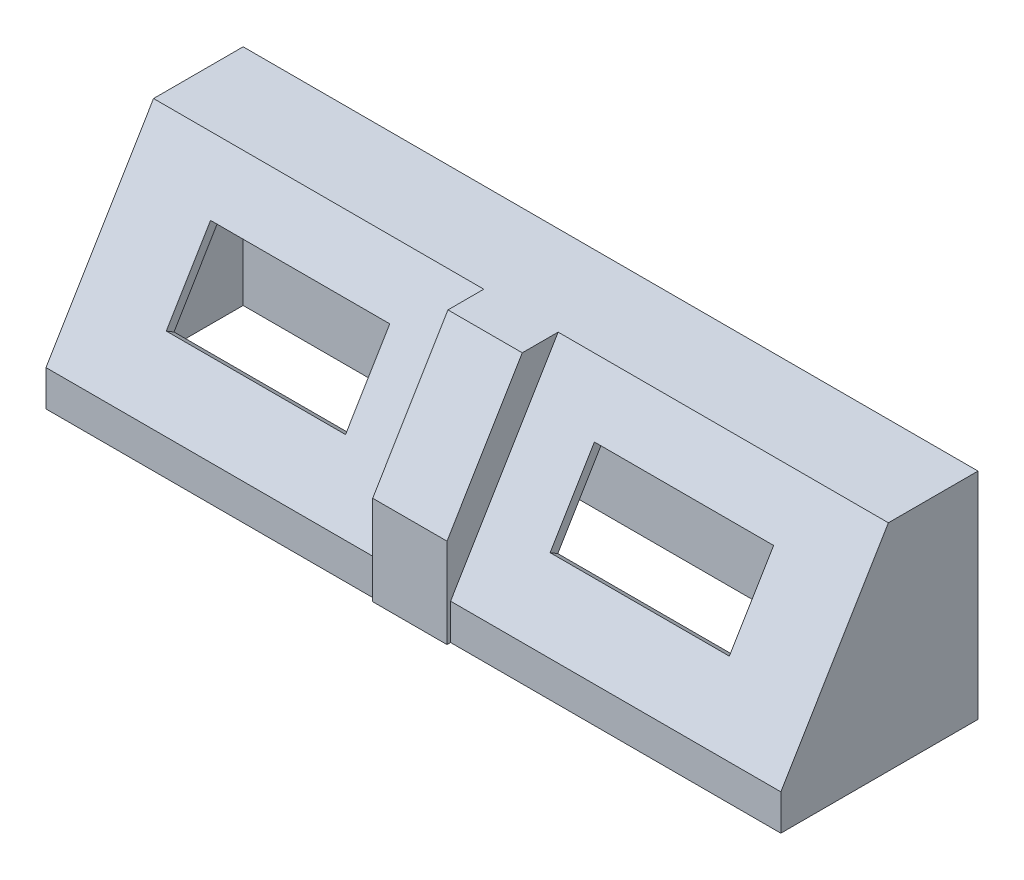
ISO-10303-21;
HEADER;
FILE_DESCRIPTION(('STEP AP214'),'2;1');
FILE_NAME('part.step','',(''),(''),'','','');
FILE_SCHEMA(('AUTOMOTIVE_DESIGN { 1 0 10303 214 1 1 1 1 }'));
ENDSEC;
DATA;
#1=APPLICATION_CONTEXT('core data for automotive mechanical design processes');
#2=APPLICATION_PROTOCOL_DEFINITION('international standard','automotive_design',2000,#1);
#3=PRODUCT_CONTEXT('',#1,'mechanical');
#4=PRODUCT('Part','Part','',(#3));
#5=PRODUCT_RELATED_PRODUCT_CATEGORY('part','',(#4));
#6=PRODUCT_DEFINITION_FORMATION('','',#4);
#7=PRODUCT_DEFINITION_CONTEXT('part definition',#1,'design');
#8=PRODUCT_DEFINITION('design','',#6,#7);
#9=PRODUCT_DEFINITION_SHAPE('','',#8);
#10=(LENGTH_UNIT() NAMED_UNIT(*) SI_UNIT(.MILLI.,.METRE.));
#11=(NAMED_UNIT(*) PLANE_ANGLE_UNIT() SI_UNIT($,.RADIAN.));
#12=(NAMED_UNIT(*) SI_UNIT($,.STERADIAN.) SOLID_ANGLE_UNIT());
#13=UNCERTAINTY_MEASURE_WITH_UNIT(LENGTH_MEASURE(1.E-05),#10,'distance_accuracy_value','');
#14=(GEOMETRIC_REPRESENTATION_CONTEXT(3) GLOBAL_UNCERTAINTY_ASSIGNED_CONTEXT((#13)) GLOBAL_UNIT_ASSIGNED_CONTEXT((#10,
#11,#12)) REPRESENTATION_CONTEXT('',''));
#15=CARTESIAN_POINT('',(0.,0.,0.));
#16=DIRECTION('',(0.,0.,1.));
#17=DIRECTION('',(1.,0.,0.));
#18=AXIS2_PLACEMENT_3D('',#15,#16,#17);
#19=CARTESIAN_POINT('',(127.,32.5444171529882,54.2406952549803));
#20=DIRECTION('',(0.,0.514495755427526,0.857492925712544));
#21=DIRECTION('',(0.,-0.857492925712544,0.514495755427526));
#22=AXIS2_PLACEMENT_3D('',#19,#20,#21);
#23=PLANE('',#22);
#24=DIRECTION('',(0.,0.857492925712544,-0.514495755427526));
#25=VECTOR('',#24,1.);
#26=CARTESIAN_POINT('',(-10.6279414810358,32.5444171529882,54.2406952549803));
#27=LINE('',#26,#25);
#28=CARTESIAN_POINT('',(-10.6279414810358,11.8205759112887,66.675));
#29=VERTEX_POINT('',#28);
#30=CARTESIAN_POINT('',(-10.6279414810358,73.025,29.9523455467732));
#31=VERTEX_POINT('',#30);
#32=EDGE_CURVE('E64',#29,#31,#27,.T.);
#33=ORIENTED_EDGE('',*,*,#32,.F.);
#34=DIRECTION('',(-1.,0.,0.));
#35=VECTOR('',#34,1.);
#36=CARTESIAN_POINT('',(127.,11.8205759112887,66.675));
#37=LINE('',#36,#35);
#38=CARTESIAN_POINT('',(-127.,11.8205759112887,66.675));
#39=VERTEX_POINT('',#38);
#40=EDGE_CURVE('E246',#29,#39,#37,.T.);
#41=ORIENTED_EDGE('',*,*,#40,.T.);
#42=DIRECTION('',(0.,0.857492925712544,-0.514495755427526));
#43=VECTOR('',#42,1.);
#44=CARTESIAN_POINT('',(-127.,32.5444171529882,54.2406952549803));
#45=LINE('',#44,#43);
#46=CARTESIAN_POINT('',(-127.,73.025,29.9523455467732));
#47=VERTEX_POINT('',#46);
#48=EDGE_CURVE('E431',#39,#47,#45,.T.);
#49=ORIENTED_EDGE('',*,*,#48,.T.);
#50=DIRECTION('',(-1.,0.,0.));
#51=VECTOR('',#50,1.);
#52=CARTESIAN_POINT('',(127.,73.025,29.9523455467732));
#53=LINE('',#52,#51);
#54=EDGE_CURVE('E258',#31,#47,#53,.T.);
#55=ORIENTED_EDGE('',*,*,#54,.F.);
#56=EDGE_LOOP('',(#33,#41,#49,#55));
#57=FACE_BOUND('',#56,.T.);
#58=DIRECTION('',(-1.,0.,0.));
#59=VECTOR('',#58,1.);
#60=CARTESIAN_POINT('',(-99.7434559506687,31.3781767014808,54.9404395258848));
#61=LINE('',#60,#59);
#62=CARTESIAN_POINT('',(-36.2434559506687,31.3781767014808,54.9404395258848));
#63=VERTEX_POINT('',#62);
#64=CARTESIAN_POINT('',(-99.7434559506687,31.3781767014808,54.9404395258847));
#65=VERTEX_POINT('',#64);
#66=EDGE_CURVE('E337',#63,#65,#61,.T.);
#67=ORIENTED_EDGE('',*,*,#66,.F.);
#68=DIRECTION('',(0.,-0.857492925712544,0.514495755427526));
#69=VECTOR('',#68,1.);
#70=CARTESIAN_POINT('',(-36.2434559506687,57.5145610771991,39.2586089004538));
#71=LINE('',#70,#69);
#72=CARTESIAN_POINT('',(-36.2434559506687,57.5145610771991,39.2586089004537));
#73=VERTEX_POINT('',#72);
#74=EDGE_CURVE('E340',#73,#63,#71,.T.);
#75=ORIENTED_EDGE('',*,*,#74,.F.);
#76=DIRECTION('',(1.,0.,0.));
#77=VECTOR('',#76,1.);
#78=CARTESIAN_POINT('',(-99.7434559506687,57.5145610771991,39.2586089004537));
#79=LINE('',#78,#77);
#80=CARTESIAN_POINT('',(-99.7434559506687,57.5145610771991,39.2586089004537));
#81=VERTEX_POINT('',#80);
#82=EDGE_CURVE('E342',#81,#73,#79,.T.);
#83=ORIENTED_EDGE('',*,*,#82,.F.);
#84=DIRECTION('',(0.,0.857492925712544,-0.514495755427526));
#85=VECTOR('',#84,1.);
#86=CARTESIAN_POINT('',(-99.7434559506687,57.5145610771991,39.2586089004538));
#87=LINE('',#86,#85);
#88=EDGE_CURVE('E334',#65,#81,#87,.T.);
#89=ORIENTED_EDGE('',*,*,#88,.F.);
#90=EDGE_LOOP('',(#67,#75,#83,#89));
#91=FACE_BOUND('',#90,.T.);
#92=ADVANCED_FACE('F42',(#57,#91),#23,.F.);
#93=CARTESIAN_POINT('',(127.,11.8205759112887,66.675));
#94=VERTEX_POINT('',#93);
#95=CARTESIAN_POINT('',(10.6279414810358,11.8205759112887,66.675));
#96=VERTEX_POINT('',#95);
#97=EDGE_CURVE('E57',#94,#96,#37,.T.);
#98=ORIENTED_EDGE('',*,*,#97,.T.);
#99=DIRECTION('',(0.,0.857492925712544,-0.514495755427526));
#100=VECTOR('',#99,1.);
#101=CARTESIAN_POINT('',(10.6279414810358,32.5444171529882,54.2406952549803));
#102=LINE('',#101,#100);
#103=CARTESIAN_POINT('',(10.6279414810358,73.025,29.9523455467732));
#104=VERTEX_POINT('',#103);
#105=EDGE_CURVE('E259',#96,#104,#102,.T.);
#106=ORIENTED_EDGE('',*,*,#105,.T.);
#107=CARTESIAN_POINT('',(127.,73.025,29.9523455467732));
#108=VERTEX_POINT('',#107);
#109=EDGE_CURVE('E254',#108,#104,#53,.T.);
#110=ORIENTED_EDGE('',*,*,#109,.F.);
#111=DIRECTION('',(0.,0.857492925712544,-0.514495755427526));
#112=VECTOR('',#111,1.);
#113=CARTESIAN_POINT('',(127.,32.5444171529882,54.2406952549803));
#114=LINE('',#113,#112);
#115=EDGE_CURVE('E437',#94,#108,#114,.T.);
#116=ORIENTED_EDGE('',*,*,#115,.F.);
#117=EDGE_LOOP('',(#98,#106,#110,#116));
#118=FACE_BOUND('',#117,.T.);
#119=DIRECTION('',(-1.,0.,0.));
#120=VECTOR('',#119,1.);
#121=CARTESIAN_POINT('',(99.7434559506687,31.3781767014808,54.9404395258848));
#122=LINE('',#121,#120);
#123=CARTESIAN_POINT('',(99.7434559506687,31.3781767014808,54.9404395258848));
#124=VERTEX_POINT('',#123);
#125=CARTESIAN_POINT('',(36.2434559506687,31.3781767014808,54.9404395258847));
#126=VERTEX_POINT('',#125);
#127=EDGE_CURVE('E388',#124,#126,#122,.T.);
#128=ORIENTED_EDGE('',*,*,#127,.F.);
#129=DIRECTION('',(0.,-0.857492925712544,0.514495755427526));
#130=VECTOR('',#129,1.);
#131=CARTESIAN_POINT('',(99.7434559506687,57.5145610771991,39.2586089004538));
#132=LINE('',#131,#130);
#133=CARTESIAN_POINT('',(99.7434559506687,57.5145610771991,39.2586089004537));
#134=VERTEX_POINT('',#133);
#135=EDGE_CURVE('E366',#134,#124,#132,.T.);
#136=ORIENTED_EDGE('',*,*,#135,.F.);
#137=DIRECTION('',(1.,0.,0.));
#138=VECTOR('',#137,1.);
#139=CARTESIAN_POINT('',(99.7434559506687,57.5145610771991,39.2586089004537));
#140=LINE('',#139,#138);
#141=CARTESIAN_POINT('',(36.2434559506687,57.5145610771991,39.2586089004537));
#142=VERTEX_POINT('',#141);
#143=EDGE_CURVE('E333',#142,#134,#140,.T.);
#144=ORIENTED_EDGE('',*,*,#143,.F.);
#145=DIRECTION('',(0.,0.857492925712544,-0.514495755427526));
#146=VECTOR('',#145,1.);
#147=CARTESIAN_POINT('',(36.2434559506687,57.5145610771991,39.2586089004538));
#148=LINE('',#147,#146);
#149=EDGE_CURVE('E377',#126,#142,#148,.T.);
#150=ORIENTED_EDGE('',*,*,#149,.F.);
#151=EDGE_LOOP('',(#128,#136,#144,#150));
#152=FACE_BOUND('',#151,.T.);
#153=ADVANCED_FACE('F485',(#118,#152),#23,.F.);
#154=CARTESIAN_POINT('',(127.,34.1779411764706,56.9632352941176));
#155=DIRECTION('',(0.,-0.514495755427527,-0.857492925712544));
#156=DIRECTION('',(0.,0.857492925712544,-0.514495755427527));
#157=AXIS2_PLACEMENT_3D('',#154,#155,#156);
#158=PLANE('',#157);
#159=DIRECTION('',(-1.,0.,0.));
#160=VECTOR('',#159,1.);
#161=CARTESIAN_POINT('',(99.7434559506687,59.1480851006815,41.9811489395911));
#162=LINE('',#161,#160);
#163=CARTESIAN_POINT('',(99.7434559506687,59.1480851006815,41.9811489395911));
#164=VERTEX_POINT('',#163);
#165=CARTESIAN_POINT('',(36.2434559506687,59.1480851006815,41.9811489395911));
#166=VERTEX_POINT('',#165);
#167=EDGE_CURVE('E383',#164,#166,#162,.T.);
#168=ORIENTED_EDGE('',*,*,#167,.F.);
#169=DIRECTION('',(0.,0.857492925712544,-0.514495755427527));
#170=VECTOR('',#169,1.);
#171=CARTESIAN_POINT('',(99.7434559506687,59.1480851006815,41.9811489395911));
#172=LINE('',#171,#170);
#173=CARTESIAN_POINT('',(99.7434559506687,33.0117007249632,57.6629795650221));
#174=VERTEX_POINT('',#173);
#175=EDGE_CURVE('E346',#174,#164,#172,.T.);
#176=ORIENTED_EDGE('',*,*,#175,.F.);
#177=DIRECTION('',(1.,0.,0.));
#178=VECTOR('',#177,1.);
#179=CARTESIAN_POINT('',(99.7434559506687,33.0117007249632,57.6629795650221));
#180=LINE('',#179,#178);
#181=CARTESIAN_POINT('',(36.2434559506687,33.0117007249632,57.6629795650221));
#182=VERTEX_POINT('',#181);
#183=EDGE_CURVE('E370',#182,#174,#180,.T.);
#184=ORIENTED_EDGE('',*,*,#183,.F.);
#185=DIRECTION('',(0.,-0.857492925712544,0.514495755427527));
#186=VECTOR('',#185,1.);
#187=CARTESIAN_POINT('',(36.2434559506687,59.1480851006815,41.9811489395911));
#188=LINE('',#187,#186);
#189=EDGE_CURVE('E380',#166,#182,#188,.T.);
#190=ORIENTED_EDGE('',*,*,#189,.F.);
#191=EDGE_LOOP('',(#168,#176,#184,#190));
#192=FACE_BOUND('',#191,.T.);
#193=DIRECTION('',(0.,0.857492925712544,-0.514495755427527));
#194=VECTOR('',#193,1.);
#195=CARTESIAN_POINT('',(13.1679414810358,34.1779411764706,56.9632352941176));
#196=LINE('',#195,#194);
#197=CARTESIAN_POINT('',(13.1679414810358,12.7,69.85));
#198=VERTEX_POINT('',#197);
#199=CARTESIAN_POINT('',(13.1679414810358,76.2,31.75));
#200=VERTEX_POINT('',#199);
#201=EDGE_CURVE('E317',#198,#200,#196,.T.);
#202=ORIENTED_EDGE('',*,*,#201,.F.);
#203=DIRECTION('',(-1.,0.,0.));
#204=VECTOR('',#203,1.);
#205=CARTESIAN_POINT('',(127.,12.7,69.85));
#206=LINE('',#205,#204);
#207=CARTESIAN_POINT('',(130.175,12.7,69.85));
#208=VERTEX_POINT('',#207);
#209=EDGE_CURVE('E457',#208,#198,#206,.T.);
#210=ORIENTED_EDGE('',*,*,#209,.F.);
#211=DIRECTION('',(0.,-0.857492925712544,0.514495755427526));
#212=VECTOR('',#211,1.);
#213=CARTESIAN_POINT('',(130.175,34.1779411764706,56.9632352941176));
#214=LINE('',#213,#212);
#215=CARTESIAN_POINT('',(130.175,76.2,31.75));
#216=VERTEX_POINT('',#215);
#217=EDGE_CURVE('E418',#216,#208,#214,.T.);
#218=ORIENTED_EDGE('',*,*,#217,.F.);
#219=DIRECTION('',(-1.,0.,0.));
#220=VECTOR('',#219,1.);
#221=CARTESIAN_POINT('',(127.,76.2,31.75));
#222=LINE('',#221,#220);
#223=EDGE_CURVE('E461',#216,#200,#222,.T.);
#224=ORIENTED_EDGE('',*,*,#223,.T.);
#225=EDGE_LOOP('',(#202,#210,#218,#224));
#226=FACE_BOUND('',#225,.T.);
#227=ADVANCED_FACE('F523',(#192,#226),#158,.F.);
#228=DIRECTION('',(-1.,0.,0.));
#229=VECTOR('',#228,1.);
#230=CARTESIAN_POINT('',(-99.7434559506687,59.1480851006815,41.9811489395911));
#231=LINE('',#230,#229);
#232=CARTESIAN_POINT('',(-36.2434559506687,59.1480851006815,41.9811489395911));
#233=VERTEX_POINT('',#232);
#234=CARTESIAN_POINT('',(-99.7434559506687,59.1480851006815,41.9811489395911));
#235=VERTEX_POINT('',#234);
#236=EDGE_CURVE('E345',#233,#235,#231,.T.);
#237=ORIENTED_EDGE('',*,*,#236,.F.);
#238=DIRECTION('',(0.,0.857492925712544,-0.514495755427527));
#239=VECTOR('',#238,1.);
#240=CARTESIAN_POINT('',(-36.2434559506687,59.1480851006815,41.9811489395911));
#241=LINE('',#240,#239);
#242=CARTESIAN_POINT('',(-36.2434559506687,33.0117007249632,57.6629795650221));
#243=VERTEX_POINT('',#242);
#244=EDGE_CURVE('E343',#243,#233,#241,.T.);
#245=ORIENTED_EDGE('',*,*,#244,.F.);
#246=DIRECTION('',(1.,0.,0.));
#247=VECTOR('',#246,1.);
#248=CARTESIAN_POINT('',(-99.7434559506687,33.0117007249632,57.6629795650221));
#249=LINE('',#248,#247);
#250=CARTESIAN_POINT('',(-99.7434559506687,33.0117007249632,57.6629795650221));
#251=VERTEX_POINT('',#250);
#252=EDGE_CURVE('E352',#251,#243,#249,.T.);
#253=ORIENTED_EDGE('',*,*,#252,.F.);
#254=DIRECTION('',(0.,-0.857492925712544,0.514495755427527));
#255=VECTOR('',#254,1.);
#256=CARTESIAN_POINT('',(-99.7434559506687,59.1480851006815,41.9811489395911));
#257=LINE('',#256,#255);
#258=EDGE_CURVE('E349',#235,#251,#257,.T.);
#259=ORIENTED_EDGE('',*,*,#258,.F.);
#260=EDGE_LOOP('',(#237,#245,#253,#259));
#261=FACE_BOUND('',#260,.T.);
#262=CARTESIAN_POINT('',(-13.1679414810358,12.7,69.85));
#263=VERTEX_POINT('',#262);
#264=CARTESIAN_POINT('',(-130.175,12.7,69.85));
#265=VERTEX_POINT('',#264);
#266=EDGE_CURVE('E456',#263,#265,#206,.T.);
#267=ORIENTED_EDGE('',*,*,#266,.F.);
#268=DIRECTION('',(0.,-0.857492925712544,0.514495755427527));
#269=VECTOR('',#268,1.);
#270=CARTESIAN_POINT('',(-13.1679414810358,34.1779411764706,56.9632352941176));
#271=LINE('',#270,#269);
#272=CARTESIAN_POINT('',(-13.1679414810358,76.2,31.75));
#273=VERTEX_POINT('',#272);
#274=EDGE_CURVE('E312',#273,#263,#271,.T.);
#275=ORIENTED_EDGE('',*,*,#274,.F.);
#276=CARTESIAN_POINT('',(-130.175,76.2,31.75));
#277=VERTEX_POINT('',#276);
#278=EDGE_CURVE('E460',#273,#277,#222,.T.);
#279=ORIENTED_EDGE('',*,*,#278,.T.);
#280=DIRECTION('',(0.,-0.857492925712544,0.514495755427526));
#281=VECTOR('',#280,1.);
#282=CARTESIAN_POINT('',(-130.175,34.1779411764706,56.9632352941176));
#283=LINE('',#282,#281);
#284=EDGE_CURVE('E398',#277,#265,#283,.T.);
#285=ORIENTED_EDGE('',*,*,#284,.T.);
#286=EDGE_LOOP('',(#267,#275,#279,#285));
#287=FACE_BOUND('',#286,.T.);
#288=ADVANCED_FACE('F536',(#261,#287),#158,.F.);
#289=CARTESIAN_POINT('',(127.,0.,69.85));
#290=DIRECTION('',(0.,0.,-1.));
#291=DIRECTION('',(-1.,0.,0.));
#292=AXIS2_PLACEMENT_3D('',#289,#290,#291);
#293=PLANE('',#292);
#294=DIRECTION('',(0.,1.,0.));
#295=VECTOR('',#294,1.);
#296=CARTESIAN_POINT('',(13.1679414810358,0.,69.85));
#297=LINE('',#296,#295);
#298=CARTESIAN_POINT('',(13.1679414810358,0.,69.85));
#299=VERTEX_POINT('',#298);
#300=EDGE_CURVE('E309',#299,#198,#297,.T.);
#301=ORIENTED_EDGE('',*,*,#300,.F.);
#302=DIRECTION('',(-1.,0.,0.));
#303=VECTOR('',#302,1.);
#304=CARTESIAN_POINT('',(127.,0.,69.85));
#305=LINE('',#304,#303);
#306=CARTESIAN_POINT('',(130.175,0.,69.85));
#307=VERTEX_POINT('',#306);
#308=EDGE_CURVE('E453',#307,#299,#305,.T.);
#309=ORIENTED_EDGE('',*,*,#308,.F.);
#310=DIRECTION('',(0.,-1.,0.));
#311=VECTOR('',#310,1.);
#312=CARTESIAN_POINT('',(130.175,0.,69.85));
#313=LINE('',#312,#311);
#314=EDGE_CURVE('E421',#208,#307,#313,.T.);
#315=ORIENTED_EDGE('',*,*,#314,.F.);
#316=ORIENTED_EDGE('',*,*,#209,.T.);
#317=EDGE_LOOP('',(#301,#309,#315,#316));
#318=FACE_BOUND('',#317,.T.);
#319=ADVANCED_FACE('F533',(#318),#293,.F.);
#320=DIRECTION('',(0.,-1.,0.));
#321=VECTOR('',#320,1.);
#322=CARTESIAN_POINT('',(-13.1679414810358,0.,69.85));
#323=LINE('',#322,#321);
#324=CARTESIAN_POINT('',(-13.1679414810358,0.,69.85));
#325=VERTEX_POINT('',#324);
#326=EDGE_CURVE('E302',#263,#325,#323,.T.);
#327=ORIENTED_EDGE('',*,*,#326,.F.);
#328=ORIENTED_EDGE('',*,*,#266,.T.);
#329=DIRECTION('',(0.,-1.,0.));
#330=VECTOR('',#329,1.);
#331=CARTESIAN_POINT('',(-130.175,0.,69.85));
#332=LINE('',#331,#330);
#333=CARTESIAN_POINT('',(-130.175,0.,69.85));
#334=VERTEX_POINT('',#333);
#335=EDGE_CURVE('E395',#265,#334,#332,.T.);
#336=ORIENTED_EDGE('',*,*,#335,.T.);
#337=EDGE_CURVE('E452',#325,#334,#305,.T.);
#338=ORIENTED_EDGE('',*,*,#337,.F.);
#339=EDGE_LOOP('',(#327,#328,#336,#338));
#340=FACE_BOUND('',#339,.T.);
#341=ADVANCED_FACE('F529',(#340),#293,.F.);
#342=CARTESIAN_POINT('',(127.,0.,66.675));
#343=DIRECTION('',(0.,0.,1.));
#344=DIRECTION('',(1.,0.,0.));
#345=AXIS2_PLACEMENT_3D('',#342,#343,#344);
#346=PLANE('',#345);
#347=DIRECTION('',(-1.,0.,0.));
#348=VECTOR('',#347,1.);
#349=CARTESIAN_POINT('',(127.,0.,66.675));
#350=LINE('',#349,#348);
#351=CARTESIAN_POINT('',(127.,0.,66.675));
#352=VERTEX_POINT('',#351);
#353=CARTESIAN_POINT('',(10.6279414810358,0.,66.675));
#354=VERTEX_POINT('',#353);
#355=EDGE_CURVE('E450',#352,#354,#350,.T.);
#356=ORIENTED_EDGE('',*,*,#355,.T.);
#357=DIRECTION('',(0.,1.,0.));
#358=VECTOR('',#357,1.);
#359=CARTESIAN_POINT('',(10.6279414810358,32.5444171529882,66.675));
#360=LINE('',#359,#358);
#361=EDGE_CURVE('E491',#354,#96,#360,.T.);
#362=ORIENTED_EDGE('',*,*,#361,.T.);
#363=ORIENTED_EDGE('',*,*,#97,.F.);
#364=DIRECTION('',(0.,1.,0.));
#365=VECTOR('',#364,1.);
#366=CARTESIAN_POINT('',(127.,0.,66.675));
#367=LINE('',#366,#365);
#368=EDGE_CURVE('E434',#352,#94,#367,.T.);
#369=ORIENTED_EDGE('',*,*,#368,.F.);
#370=EDGE_LOOP('',(#356,#362,#363,#369));
#371=FACE_BOUND('',#370,.T.);
#372=ADVANCED_FACE('F494',(#371),#346,.F.);
#373=ORIENTED_EDGE('',*,*,#40,.F.);
#374=DIRECTION('',(0.,1.,0.));
#375=VECTOR('',#374,1.);
#376=CARTESIAN_POINT('',(-10.6279414810358,32.5444171529882,66.675));
#377=LINE('',#376,#375);
#378=CARTESIAN_POINT('',(-10.6279414810358,0.,66.675));
#379=VERTEX_POINT('',#378);
#380=EDGE_CURVE('E12',#379,#29,#377,.T.);
#381=ORIENTED_EDGE('',*,*,#380,.F.);
#382=CARTESIAN_POINT('',(-127.,0.,66.675));
#383=VERTEX_POINT('',#382);
#384=EDGE_CURVE('E449',#379,#383,#350,.T.);
#385=ORIENTED_EDGE('',*,*,#384,.T.);
#386=DIRECTION('',(0.,1.,0.));
#387=VECTOR('',#386,1.);
#388=CARTESIAN_POINT('',(-127.,0.,66.675));
#389=LINE('',#388,#387);
#390=EDGE_CURVE('E250',#383,#39,#389,.T.);
#391=ORIENTED_EDGE('',*,*,#390,.T.);
#392=EDGE_LOOP('',(#373,#381,#385,#391));
#393=FACE_BOUND('',#392,.T.);
#394=ADVANCED_FACE('F247',(#393),#346,.F.);
#395=CARTESIAN_POINT('',(127.,73.025,0.));
#396=DIRECTION('',(0.,1.,0.));
#397=DIRECTION('',(0.,0.,1.));
#398=AXIS2_PLACEMENT_3D('',#395,#396,#397);
#399=PLANE('',#398);
#400=DIRECTION('',(0.,0.,-1.));
#401=VECTOR('',#400,1.);
#402=CARTESIAN_POINT('',(-127.,73.025,0.));
#403=LINE('',#402,#401);
#404=CARTESIAN_POINT('',(-127.,73.025,3.175));
#405=VERTEX_POINT('',#404);
#406=EDGE_CURVE('E424',#47,#405,#403,.T.);
#407=ORIENTED_EDGE('',*,*,#406,.T.);
#408=DIRECTION('',(-1.,0.,0.));
#409=VECTOR('',#408,1.);
#410=CARTESIAN_POINT('',(127.,73.025,3.175));
#411=LINE('',#410,#409);
#412=CARTESIAN_POINT('',(127.,73.025,3.175));
#413=VERTEX_POINT('',#412);
#414=EDGE_CURVE('E50',#413,#405,#411,.T.);
#415=ORIENTED_EDGE('',*,*,#414,.F.);
#416=DIRECTION('',(0.,0.,-1.));
#417=VECTOR('',#416,1.);
#418=CARTESIAN_POINT('',(127.,73.025,0.));
#419=LINE('',#418,#417);
#420=EDGE_CURVE('E427',#108,#413,#419,.T.);
#421=ORIENTED_EDGE('',*,*,#420,.F.);
#422=ORIENTED_EDGE('',*,*,#109,.T.);
#423=DIRECTION('',(0.,0.,-1.));
#424=VECTOR('',#423,1.);
#425=CARTESIAN_POINT('',(10.6279414810358,73.025,42.6523455467732));
#426=LINE('',#425,#424);
#427=CARTESIAN_POINT('',(10.6279414810358,73.025,42.6523455467732));
#428=VERTEX_POINT('',#427);
#429=EDGE_CURVE('E293',#428,#104,#426,.T.);
#430=ORIENTED_EDGE('',*,*,#429,.F.);
#431=DIRECTION('',(1.,0.,0.));
#432=VECTOR('',#431,1.);
#433=CARTESIAN_POINT('',(127.,73.025,42.6523455467732));
#434=LINE('',#433,#432);
#435=CARTESIAN_POINT('',(-10.6279414810357,73.025,42.6523455467732));
#436=VERTEX_POINT('',#435);
#437=EDGE_CURVE('E286',#436,#428,#434,.T.);
#438=ORIENTED_EDGE('',*,*,#437,.F.);
#439=DIRECTION('',(0.,0.,-1.));
#440=VECTOR('',#439,1.);
#441=CARTESIAN_POINT('',(-10.6279414810357,73.025,42.6523455467732));
#442=LINE('',#441,#440);
#443=EDGE_CURVE('E290',#436,#31,#442,.T.);
#444=ORIENTED_EDGE('',*,*,#443,.T.);
#445=ORIENTED_EDGE('',*,*,#54,.T.);
#446=EDGE_LOOP('',(#407,#415,#421,#422,#430,#438,#444,#445));
#447=FACE_BOUND('',#446,.T.);
#448=ADVANCED_FACE('F44',(#447),#399,.F.);
#449=CARTESIAN_POINT('',(127.,0.,3.17499999999999));
#450=DIRECTION('',(0.,0.,-1.));
#451=DIRECTION('',(0.,1.,0.));
#452=AXIS2_PLACEMENT_3D('',#449,#450,#451);
#453=PLANE('',#452);
#454=DIRECTION('',(0.,-1.,0.));
#455=VECTOR('',#454,1.);
#456=CARTESIAN_POINT('',(-127.,0.,3.17499999999999));
#457=LINE('',#456,#455);
#458=CARTESIAN_POINT('',(-127.,0.,3.17499999999999));
#459=VERTEX_POINT('',#458);
#460=EDGE_CURVE('E442',#405,#459,#457,.T.);
#461=ORIENTED_EDGE('',*,*,#460,.T.);
#462=DIRECTION('',(-1.,0.,0.));
#463=VECTOR('',#462,1.);
#464=CARTESIAN_POINT('',(127.,0.,3.17499999999999));
#465=LINE('',#464,#463);
#466=CARTESIAN_POINT('',(127.,0.,3.17499999999999));
#467=VERTEX_POINT('',#466);
#468=EDGE_CURVE('E467',#467,#459,#465,.T.);
#469=ORIENTED_EDGE('',*,*,#468,.F.);
#470=DIRECTION('',(0.,-1.,0.));
#471=VECTOR('',#470,1.);
#472=CARTESIAN_POINT('',(127.,0.,3.17499999999999));
#473=LINE('',#472,#471);
#474=EDGE_CURVE('E430',#413,#467,#473,.T.);
#475=ORIENTED_EDGE('',*,*,#474,.F.);
#476=ORIENTED_EDGE('',*,*,#414,.T.);
#477=EDGE_LOOP('',(#461,#469,#475,#476));
#478=FACE_BOUND('',#477,.T.);
#479=ADVANCED_FACE('F472',(#478),#453,.F.);
#480=CARTESIAN_POINT('',(127.,0.,0.));
#481=DIRECTION('',(0.,0.,1.));
#482=DIRECTION('',(1.,0.,0.));
#483=AXIS2_PLACEMENT_3D('',#480,#481,#482);
#484=PLANE('',#483);
#485=DIRECTION('',(-1.,0.,0.));
#486=VECTOR('',#485,1.);
#487=CARTESIAN_POINT('',(127.,0.,0.));
#488=LINE('',#487,#486);
#489=CARTESIAN_POINT('',(130.175,0.,0.));
#490=VERTEX_POINT('',#489);
#491=CARTESIAN_POINT('',(-130.175,0.,0.));
#492=VERTEX_POINT('',#491);
#493=EDGE_CURVE('E465',#490,#492,#488,.T.);
#494=ORIENTED_EDGE('',*,*,#493,.T.);
#495=DIRECTION('',(0.,1.,0.));
#496=VECTOR('',#495,1.);
#497=CARTESIAN_POINT('',(-130.175,0.,0.));
#498=LINE('',#497,#496);
#499=CARTESIAN_POINT('',(-130.175,76.2,0.));
#500=VERTEX_POINT('',#499);
#501=EDGE_CURVE('E404',#492,#500,#498,.T.);
#502=ORIENTED_EDGE('',*,*,#501,.T.);
#503=DIRECTION('',(-1.,0.,0.));
#504=VECTOR('',#503,1.);
#505=CARTESIAN_POINT('',(127.,76.2,0.));
#506=LINE('',#505,#504);
#507=CARTESIAN_POINT('',(130.175,76.2,0.));
#508=VERTEX_POINT('',#507);
#509=EDGE_CURVE('E463',#508,#500,#506,.T.);
#510=ORIENTED_EDGE('',*,*,#509,.F.);
#511=DIRECTION('',(0.,1.,0.));
#512=VECTOR('',#511,1.);
#513=CARTESIAN_POINT('',(130.175,0.,0.));
#514=LINE('',#513,#512);
#515=EDGE_CURVE('E412',#490,#508,#514,.T.);
#516=ORIENTED_EDGE('',*,*,#515,.F.);
#517=EDGE_LOOP('',(#494,#502,#510,#516));
#518=FACE_BOUND('',#517,.T.);
#519=ADVANCED_FACE('F543',(#518),#484,.F.);
#520=CARTESIAN_POINT('',(127.,76.2,0.));
#521=DIRECTION('',(0.,-1.,0.));
#522=DIRECTION('',(0.,0.,-1.));
#523=AXIS2_PLACEMENT_3D('',#520,#521,#522);
#524=PLANE('',#523);
#525=ORIENTED_EDGE('',*,*,#509,.T.);
#526=DIRECTION('',(0.,0.,1.));
#527=VECTOR('',#526,1.);
#528=CARTESIAN_POINT('',(-130.175,76.2,0.));
#529=LINE('',#528,#527);
#530=EDGE_CURVE('E401',#500,#277,#529,.T.);
#531=ORIENTED_EDGE('',*,*,#530,.T.);
#532=ORIENTED_EDGE('',*,*,#278,.F.);
#533=DIRECTION('',(0.,0.,-1.));
#534=VECTOR('',#533,1.);
#535=CARTESIAN_POINT('',(-13.1679414810358,76.2,44.45));
#536=LINE('',#535,#534);
#537=CARTESIAN_POINT('',(-13.1679414810358,76.2,44.45));
#538=VERTEX_POINT('',#537);
#539=EDGE_CURVE('E324',#538,#273,#536,.T.);
#540=ORIENTED_EDGE('',*,*,#539,.F.);
#541=DIRECTION('',(-1.,0.,0.));
#542=VECTOR('',#541,1.);
#543=CARTESIAN_POINT('',(127.,76.2,44.45));
#544=LINE('',#543,#542);
#545=CARTESIAN_POINT('',(13.1679414810358,76.2,44.45));
#546=VERTEX_POINT('',#545);
#547=EDGE_CURVE('E322',#546,#538,#544,.T.);
#548=ORIENTED_EDGE('',*,*,#547,.F.);
#549=DIRECTION('',(0.,0.,-1.));
#550=VECTOR('',#549,1.);
#551=CARTESIAN_POINT('',(13.1679414810358,76.2,44.45));
#552=LINE('',#551,#550);
#553=EDGE_CURVE('E330',#546,#200,#552,.T.);
#554=ORIENTED_EDGE('',*,*,#553,.T.);
#555=ORIENTED_EDGE('',*,*,#223,.F.);
#556=DIRECTION('',(0.,0.,1.));
#557=VECTOR('',#556,1.);
#558=CARTESIAN_POINT('',(130.175,76.2,0.));
#559=LINE('',#558,#557);
#560=EDGE_CURVE('E415',#508,#216,#559,.T.);
#561=ORIENTED_EDGE('',*,*,#560,.F.);
#562=EDGE_LOOP('',(#525,#531,#532,#540,#548,#554,#555,#561));
#563=FACE_BOUND('',#562,.T.);
#564=ADVANCED_FACE('F532',(#563),#524,.F.);
#565=CARTESIAN_POINT('',(127.,0.,0.));
#566=DIRECTION('',(0.,1.,0.));
#567=DIRECTION('',(0.,0.,1.));
#568=AXIS2_PLACEMENT_3D('',#565,#566,#567);
#569=PLANE('',#568);
#570=ORIENTED_EDGE('',*,*,#384,.F.);
#571=DIRECTION('',(0.,0.,1.));
#572=VECTOR('',#571,1.);
#573=CARTESIAN_POINT('',(-10.6279414810358,0.,53.34));
#574=LINE('',#573,#572);
#575=CARTESIAN_POINT('',(-10.6279414810358,0.,68.58));
#576=VERTEX_POINT('',#575);
#577=EDGE_CURVE('E264',#379,#576,#574,.T.);
#578=ORIENTED_EDGE('',*,*,#577,.T.);
#579=DIRECTION('',(1.,0.,0.));
#580=VECTOR('',#579,1.);
#581=CARTESIAN_POINT('',(-10.6279414810358,0.,68.58));
#582=LINE('',#581,#580);
#583=CARTESIAN_POINT('',(10.6279414810358,0.,68.58));
#584=VERTEX_POINT('',#583);
#585=EDGE_CURVE('E497',#576,#584,#582,.T.);
#586=ORIENTED_EDGE('',*,*,#585,.T.);
#587=DIRECTION('',(0.,0.,1.));
#588=VECTOR('',#587,1.);
#589=CARTESIAN_POINT('',(10.6279414810358,0.,53.34));
#590=LINE('',#589,#588);
#591=EDGE_CURVE('E270',#354,#584,#590,.T.);
#592=ORIENTED_EDGE('',*,*,#591,.F.);
#593=ORIENTED_EDGE('',*,*,#355,.F.);
#594=DIRECTION('',(0.,0.,-1.));
#595=VECTOR('',#594,1.);
#596=CARTESIAN_POINT('',(127.,0.,0.));
#597=LINE('',#596,#595);
#598=EDGE_CURVE('E407',#352,#467,#597,.T.);
#599=ORIENTED_EDGE('',*,*,#598,.T.);
#600=ORIENTED_EDGE('',*,*,#468,.T.);
#601=DIRECTION('',(0.,0.,-1.));
#602=VECTOR('',#601,1.);
#603=CARTESIAN_POINT('',(-127.,0.,0.));
#604=LINE('',#603,#602);
#605=EDGE_CURVE('E364',#383,#459,#604,.T.);
#606=ORIENTED_EDGE('',*,*,#605,.F.);
#607=EDGE_LOOP('',(#570,#578,#586,#592,#593,#599,#600,#606));
#608=FACE_BOUND('',#607,.T.);
#609=ORIENTED_EDGE('',*,*,#308,.T.);
#610=DIRECTION('',(0.,0.,-1.));
#611=VECTOR('',#610,1.);
#612=CARTESIAN_POINT('',(13.1679414810358,0.,71.12));
#613=LINE('',#612,#611);
#614=CARTESIAN_POINT('',(13.1679414810358,0.,71.12));
#615=VERTEX_POINT('',#614);
#616=EDGE_CURVE('E297',#615,#299,#613,.T.);
#617=ORIENTED_EDGE('',*,*,#616,.F.);
#618=DIRECTION('',(1.,0.,0.));
#619=VECTOR('',#618,1.);
#620=CARTESIAN_POINT('',(-13.1679414810358,0.,71.12));
#621=LINE('',#620,#619);
#622=CARTESIAN_POINT('',(-13.1679414810358,0.,71.12));
#623=VERTEX_POINT('',#622);
#624=EDGE_CURVE('E300',#623,#615,#621,.T.);
#625=ORIENTED_EDGE('',*,*,#624,.F.);
#626=DIRECTION('',(0.,0.,1.));
#627=VECTOR('',#626,1.);
#628=CARTESIAN_POINT('',(-13.1679414810358,0.,71.12));
#629=LINE('',#628,#627);
#630=EDGE_CURVE('E299',#325,#623,#629,.T.);
#631=ORIENTED_EDGE('',*,*,#630,.F.);
#632=ORIENTED_EDGE('',*,*,#337,.T.);
#633=DIRECTION('',(0.,0.,-1.));
#634=VECTOR('',#633,1.);
#635=CARTESIAN_POINT('',(-130.175,0.,0.));
#636=LINE('',#635,#634);
#637=EDGE_CURVE('E392',#334,#492,#636,.T.);
#638=ORIENTED_EDGE('',*,*,#637,.T.);
#639=ORIENTED_EDGE('',*,*,#493,.F.);
#640=DIRECTION('',(0.,0.,-1.));
#641=VECTOR('',#640,1.);
#642=CARTESIAN_POINT('',(130.175,0.,0.));
#643=LINE('',#642,#641);
#644=EDGE_CURVE('E409',#307,#490,#643,.T.);
#645=ORIENTED_EDGE('',*,*,#644,.F.);
#646=EDGE_LOOP('',(#609,#617,#625,#631,#632,#638,#639,#645));
#647=FACE_BOUND('',#646,.T.);
#648=ADVANCED_FACE('F478',(#608,#647),#569,.F.);
#649=CARTESIAN_POINT('',(127.,0.,0.));
#650=DIRECTION('',(1.,0.,0.));
#651=DIRECTION('',(0.,0.,-1.));
#652=AXIS2_PLACEMENT_3D('',#649,#650,#651);
#653=PLANE('',#652);
#654=ORIENTED_EDGE('',*,*,#420,.T.);
#655=ORIENTED_EDGE('',*,*,#474,.T.);
#656=ORIENTED_EDGE('',*,*,#598,.F.);
#657=ORIENTED_EDGE('',*,*,#368,.T.);
#658=ORIENTED_EDGE('',*,*,#115,.T.);
#659=EDGE_LOOP('',(#654,#655,#656,#657,#658));
#660=FACE_BOUND('',#659,.T.);
#661=ADVANCED_FACE('F482',(#660),#653,.F.);
#662=CARTESIAN_POINT('',(130.175,0.,0.));
#663=DIRECTION('',(1.,0.,0.));
#664=DIRECTION('',(0.,0.,-1.));
#665=AXIS2_PLACEMENT_3D('',#662,#663,#664);
#666=PLANE('',#665);
#667=ORIENTED_EDGE('',*,*,#644,.T.);
#668=ORIENTED_EDGE('',*,*,#515,.T.);
#669=ORIENTED_EDGE('',*,*,#560,.T.);
#670=ORIENTED_EDGE('',*,*,#217,.T.);
#671=ORIENTED_EDGE('',*,*,#314,.T.);
#672=EDGE_LOOP('',(#667,#668,#669,#670,#671));
#673=FACE_BOUND('',#672,.T.);
#674=ADVANCED_FACE('F750',(#673),#666,.T.);
#675=CARTESIAN_POINT('',(-130.175,0.,0.));
#676=DIRECTION('',(-1.,0.,0.));
#677=DIRECTION('',(0.,0.,-1.));
#678=AXIS2_PLACEMENT_3D('',#675,#676,#677);
#679=PLANE('',#678);
#680=ORIENTED_EDGE('',*,*,#637,.F.);
#681=ORIENTED_EDGE('',*,*,#335,.F.);
#682=ORIENTED_EDGE('',*,*,#284,.F.);
#683=ORIENTED_EDGE('',*,*,#530,.F.);
#684=ORIENTED_EDGE('',*,*,#501,.F.);
#685=EDGE_LOOP('',(#680,#681,#682,#683,#684));
#686=FACE_BOUND('',#685,.T.);
#687=ADVANCED_FACE('F743',(#686),#679,.T.);
#688=CARTESIAN_POINT('',(-127.,0.,0.));
#689=DIRECTION('',(-1.,0.,0.));
#690=DIRECTION('',(0.,0.,-1.));
#691=AXIS2_PLACEMENT_3D('',#688,#689,#690);
#692=PLANE('',#691);
#693=ORIENTED_EDGE('',*,*,#390,.F.);
#694=ORIENTED_EDGE('',*,*,#605,.T.);
#695=ORIENTED_EDGE('',*,*,#460,.F.);
#696=ORIENTED_EDGE('',*,*,#406,.F.);
#697=ORIENTED_EDGE('',*,*,#48,.F.);
#698=EDGE_LOOP('',(#693,#694,#695,#696,#697));
#699=FACE_BOUND('',#698,.T.);
#700=ADVANCED_FACE('F476',(#699),#692,.F.);
#701=CARTESIAN_POINT('',(99.7434559506687,21.2753543270183,-21.1400690165143));
#702=DIRECTION('',(1.,0.,0.));
#703=DIRECTION('',(0.,0.,-1.));
#704=AXIS2_PLACEMENT_3D('',#701,#702,#703);
#705=PLANE('',#704);
#706=ORIENTED_EDGE('',*,*,#135,.T.);
#707=DIRECTION('',(0.,0.514495755427527,0.857492925712544));
#708=VECTOR('',#707,1.);
#709=CARTESIAN_POINT('',(99.7434559506687,-4.86103004870008,-5.45823839108333));
#710=LINE('',#709,#708);
#711=EDGE_CURVE('E375',#124,#174,#710,.T.);
#712=ORIENTED_EDGE('',*,*,#711,.T.);
#713=ORIENTED_EDGE('',*,*,#175,.T.);
#714=DIRECTION('',(0.,0.514495755427527,0.857492925712544));
#715=VECTOR('',#714,1.);
#716=CARTESIAN_POINT('',(99.7434559506687,21.2753543270183,-21.1400690165143));
#717=LINE('',#716,#715);
#718=EDGE_CURVE('E367',#134,#164,#717,.T.);
#719=ORIENTED_EDGE('',*,*,#718,.F.);
#720=EDGE_LOOP('',(#706,#712,#713,#719));
#721=FACE_BOUND('',#720,.T.);
#722=ADVANCED_FACE('F728',(#721),#705,.F.);
#723=CARTESIAN_POINT('',(99.7434559506687,-4.86103004870008,-5.45823839108333));
#724=DIRECTION('',(0.,-0.857492925712544,0.514495755427527));
#725=DIRECTION('',(0.,-0.514495755427527,-0.857492925712544));
#726=AXIS2_PLACEMENT_3D('',#723,#724,#725);
#727=PLANE('',#726);
#728=ORIENTED_EDGE('',*,*,#127,.T.);
#729=DIRECTION('',(0.,0.514495755427527,0.857492925712544));
#730=VECTOR('',#729,1.);
#731=CARTESIAN_POINT('',(36.2434559506687,-4.86103004870008,-5.45823839108333));
#732=LINE('',#731,#730);
#733=EDGE_CURVE('E373',#126,#182,#732,.T.);
#734=ORIENTED_EDGE('',*,*,#733,.T.);
#735=ORIENTED_EDGE('',*,*,#183,.T.);
#736=ORIENTED_EDGE('',*,*,#711,.F.);
#737=EDGE_LOOP('',(#728,#734,#735,#736));
#738=FACE_BOUND('',#737,.T.);
#739=ADVANCED_FACE('F720',(#738),#727,.F.);
#740=CARTESIAN_POINT('',(36.2434559506687,21.2753543270183,-21.1400690165143));
#741=DIRECTION('',(-1.,0.,0.));
#742=DIRECTION('',(0.,0.,1.));
#743=AXIS2_PLACEMENT_3D('',#740,#741,#742);
#744=PLANE('',#743);
#745=ORIENTED_EDGE('',*,*,#149,.T.);
#746=DIRECTION('',(0.,0.514495755427527,0.857492925712544));
#747=VECTOR('',#746,1.);
#748=CARTESIAN_POINT('',(36.2434559506687,21.2753543270183,-21.1400690165143));
#749=LINE('',#748,#747);
#750=EDGE_CURVE('E371',#142,#166,#749,.T.);
#751=ORIENTED_EDGE('',*,*,#750,.T.);
#752=ORIENTED_EDGE('',*,*,#189,.T.);
#753=ORIENTED_EDGE('',*,*,#733,.F.);
#754=EDGE_LOOP('',(#745,#751,#752,#753));
#755=FACE_BOUND('',#754,.T.);
#756=ADVANCED_FACE('F712',(#755),#744,.F.);
#757=CARTESIAN_POINT('',(99.7434559506687,21.2753543270183,-21.1400690165143));
#758=DIRECTION('',(0.,0.857492925712544,-0.514495755427527));
#759=DIRECTION('',(0.,0.514495755427527,0.857492925712544));
#760=AXIS2_PLACEMENT_3D('',#757,#758,#759);
#761=PLANE('',#760);
#762=ORIENTED_EDGE('',*,*,#143,.T.);
#763=ORIENTED_EDGE('',*,*,#718,.T.);
#764=ORIENTED_EDGE('',*,*,#167,.T.);
#765=ORIENTED_EDGE('',*,*,#750,.F.);
#766=EDGE_LOOP('',(#762,#763,#764,#765));
#767=FACE_BOUND('',#766,.T.);
#768=ADVANCED_FACE('F704',(#767),#761,.F.);
#769=CARTESIAN_POINT('',(-36.2434559506687,21.2753543270183,-21.1400690165143));
#770=DIRECTION('',(1.,0.,0.));
#771=DIRECTION('',(0.,0.,-1.));
#772=AXIS2_PLACEMENT_3D('',#769,#770,#771);
#773=PLANE('',#772);
#774=ORIENTED_EDGE('',*,*,#74,.T.);
#775=DIRECTION('',(0.,0.514495755427527,0.857492925712544));
#776=VECTOR('',#775,1.);
#777=CARTESIAN_POINT('',(-36.2434559506687,-4.86103004870008,-5.45823839108333));
#778=LINE('',#777,#776);
#779=EDGE_CURVE('E338',#63,#243,#778,.T.);
#780=ORIENTED_EDGE('',*,*,#779,.T.);
#781=ORIENTED_EDGE('',*,*,#244,.T.);
#782=DIRECTION('',(0.,0.514495755427527,0.857492925712544));
#783=VECTOR('',#782,1.);
#784=CARTESIAN_POINT('',(-36.2434559506687,21.2753543270183,-21.1400690165143));
#785=LINE('',#784,#783);
#786=EDGE_CURVE('E355',#73,#233,#785,.T.);
#787=ORIENTED_EDGE('',*,*,#786,.F.);
#788=EDGE_LOOP('',(#774,#780,#781,#787));
#789=FACE_BOUND('',#788,.T.);
#790=ADVANCED_FACE('F696',(#789),#773,.F.);
#791=CARTESIAN_POINT('',(-99.7434559506687,-4.86103004870008,-5.45823839108333));
#792=DIRECTION('',(0.,-0.857492925712544,0.514495755427527));
#793=DIRECTION('',(0.,-0.514495755427527,-0.857492925712544));
#794=AXIS2_PLACEMENT_3D('',#791,#792,#793);
#795=PLANE('',#794);
#796=ORIENTED_EDGE('',*,*,#66,.T.);
#797=DIRECTION('',(0.,0.514495755427527,0.857492925712544));
#798=VECTOR('',#797,1.);
#799=CARTESIAN_POINT('',(-99.7434559506687,-4.86103004870008,-5.45823839108333));
#800=LINE('',#799,#798);
#801=EDGE_CURVE('E357',#65,#251,#800,.T.);
#802=ORIENTED_EDGE('',*,*,#801,.T.);
#803=ORIENTED_EDGE('',*,*,#252,.T.);
#804=ORIENTED_EDGE('',*,*,#779,.F.);
#805=EDGE_LOOP('',(#796,#802,#803,#804));
#806=FACE_BOUND('',#805,.T.);
#807=ADVANCED_FACE('F688',(#806),#795,.F.);
#808=CARTESIAN_POINT('',(-99.7434559506687,21.2753543270183,-21.1400690165143));
#809=DIRECTION('',(-1.,0.,0.));
#810=DIRECTION('',(0.,0.,1.));
#811=AXIS2_PLACEMENT_3D('',#808,#809,#810);
#812=PLANE('',#811);
#813=ORIENTED_EDGE('',*,*,#88,.T.);
#814=DIRECTION('',(0.,0.514495755427527,0.857492925712544));
#815=VECTOR('',#814,1.);
#816=CARTESIAN_POINT('',(-99.7434559506687,21.2753543270183,-21.1400690165143));
#817=LINE('',#816,#815);
#818=EDGE_CURVE('E359',#81,#235,#817,.T.);
#819=ORIENTED_EDGE('',*,*,#818,.T.);
#820=ORIENTED_EDGE('',*,*,#258,.T.);
#821=ORIENTED_EDGE('',*,*,#801,.F.);
#822=EDGE_LOOP('',(#813,#819,#820,#821));
#823=FACE_BOUND('',#822,.T.);
#824=ADVANCED_FACE('F680',(#823),#812,.F.);
#825=CARTESIAN_POINT('',(-99.7434559506687,21.2753543270183,-21.1400690165143));
#826=DIRECTION('',(0.,0.857492925712544,-0.514495755427527));
#827=DIRECTION('',(0.,0.514495755427527,0.857492925712544));
#828=AXIS2_PLACEMENT_3D('',#825,#826,#827);
#829=PLANE('',#828);
#830=ORIENTED_EDGE('',*,*,#82,.T.);
#831=ORIENTED_EDGE('',*,*,#786,.T.);
#832=ORIENTED_EDGE('',*,*,#236,.T.);
#833=ORIENTED_EDGE('',*,*,#818,.F.);
#834=EDGE_LOOP('',(#830,#831,#832,#833));
#835=FACE_BOUND('',#834,.T.);
#836=ADVANCED_FACE('F668',(#835),#829,.F.);
#837=CARTESIAN_POINT('',(-13.1679414810358,34.1779411764706,69.6632352941176));
#838=DIRECTION('',(1.,0.,0.));
#839=DIRECTION('',(0.,0.,-1.));
#840=AXIS2_PLACEMENT_3D('',#837,#838,#839);
#841=PLANE('',#840);
#842=ORIENTED_EDGE('',*,*,#274,.T.);
#843=ORIENTED_EDGE('',*,*,#326,.T.);
#844=ORIENTED_EDGE('',*,*,#630,.T.);
#845=DIRECTION('',(0.,1.,0.));
#846=VECTOR('',#845,1.);
#847=CARTESIAN_POINT('',(-13.1679414810358,-29.2381383024285,71.12));
#848=LINE('',#847,#846);
#849=CARTESIAN_POINT('',(-13.1679414810358,31.75,71.12));
#850=VERTEX_POINT('',#849);
#851=EDGE_CURVE('E295',#623,#850,#848,.T.);
#852=ORIENTED_EDGE('',*,*,#851,.T.);
#853=DIRECTION('',(0.,-0.857492925712544,0.514495755427527));
#854=VECTOR('',#853,1.);
#855=CARTESIAN_POINT('',(-13.1679414810358,34.1779411764706,69.6632352941176));
#856=LINE('',#855,#854);
#857=EDGE_CURVE('E313',#538,#850,#856,.T.);
#858=ORIENTED_EDGE('',*,*,#857,.F.);
#859=ORIENTED_EDGE('',*,*,#539,.T.);
#860=EDGE_LOOP('',(#842,#843,#844,#852,#858,#859));
#861=FACE_BOUND('',#860,.T.);
#862=ADVANCED_FACE('F659',(#861),#841,.F.);
#863=CARTESIAN_POINT('',(13.1679414810358,34.1779411764706,69.6632352941176));
#864=DIRECTION('',(-1.,0.,0.));
#865=DIRECTION('',(0.,0.,1.));
#866=AXIS2_PLACEMENT_3D('',#863,#864,#865);
#867=PLANE('',#866);
#868=ORIENTED_EDGE('',*,*,#201,.T.);
#869=ORIENTED_EDGE('',*,*,#553,.F.);
#870=DIRECTION('',(0.,0.857492925712544,-0.514495755427527));
#871=VECTOR('',#870,1.);
#872=CARTESIAN_POINT('',(13.1679414810358,34.1779411764706,69.6632352941176));
#873=LINE('',#872,#871);
#874=CARTESIAN_POINT('',(13.1679414810358,31.75,71.12));
#875=VERTEX_POINT('',#874);
#876=EDGE_CURVE('E320',#875,#546,#873,.T.);
#877=ORIENTED_EDGE('',*,*,#876,.F.);
#878=DIRECTION('',(0.,1.,0.));
#879=VECTOR('',#878,1.);
#880=CARTESIAN_POINT('',(13.1679414810358,-29.2381383024285,71.12));
#881=LINE('',#880,#879);
#882=EDGE_CURVE('E304',#615,#875,#881,.T.);
#883=ORIENTED_EDGE('',*,*,#882,.F.);
#884=ORIENTED_EDGE('',*,*,#616,.T.);
#885=ORIENTED_EDGE('',*,*,#300,.T.);
#886=EDGE_LOOP('',(#868,#869,#877,#883,#884,#885));
#887=FACE_BOUND('',#886,.T.);
#888=ADVANCED_FACE('F648',(#887),#867,.F.);
#889=CARTESIAN_POINT('',(0.,34.1779411764706,69.6632352941176));
#890=DIRECTION('',(0.,0.514495755427527,0.857492925712544));
#891=DIRECTION('',(0.,-0.857492925712544,0.514495755427527));
#892=AXIS2_PLACEMENT_3D('',#889,#890,#891);
#893=PLANE('',#892);
#894=ORIENTED_EDGE('',*,*,#857,.T.);
#895=DIRECTION('',(1.,0.,0.));
#896=VECTOR('',#895,1.);
#897=CARTESIAN_POINT('',(127.,31.75,71.12));
#898=LINE('',#897,#896);
#899=EDGE_CURVE('E316',#850,#875,#898,.T.);
#900=ORIENTED_EDGE('',*,*,#899,.T.);
#901=ORIENTED_EDGE('',*,*,#876,.T.);
#902=ORIENTED_EDGE('',*,*,#547,.T.);
#903=EDGE_LOOP('',(#894,#900,#901,#902));
#904=FACE_BOUND('',#903,.T.);
#905=ADVANCED_FACE('F635',(#904),#893,.T.);
#906=CARTESIAN_POINT('',(-13.1679414810358,-29.2381383024285,71.12));
#907=DIRECTION('',(0.,0.,-1.));
#908=DIRECTION('',(-1.,0.,0.));
#909=AXIS2_PLACEMENT_3D('',#906,#907,#908);
#910=PLANE('',#909);
#911=ORIENTED_EDGE('',*,*,#851,.F.);
#912=ORIENTED_EDGE('',*,*,#624,.T.);
#913=ORIENTED_EDGE('',*,*,#882,.T.);
#914=ORIENTED_EDGE('',*,*,#899,.F.);
#915=EDGE_LOOP('',(#911,#912,#913,#914));
#916=FACE_BOUND('',#915,.T.);
#917=ADVANCED_FACE('F630',(#916),#910,.F.);
#918=CARTESIAN_POINT('',(10.6279414810358,32.5444171529882,66.9406952549803));
#919=DIRECTION('',(-1.,0.,0.));
#920=DIRECTION('',(0.,-1.,0.));
#921=AXIS2_PLACEMENT_3D('',#918,#919,#920);
#922=PLANE('',#921);
#923=ORIENTED_EDGE('',*,*,#361,.F.);
#924=ORIENTED_EDGE('',*,*,#591,.T.);
#925=DIRECTION('',(0.,1.,0.));
#926=VECTOR('',#925,1.);
#927=CARTESIAN_POINT('',(10.6279414810358,31.75,68.58));
#928=LINE('',#927,#926);
#929=CARTESIAN_POINT('',(10.6279414810358,31.75,68.58));
#930=VERTEX_POINT('',#929);
#931=EDGE_CURVE('E276',#584,#930,#928,.T.);
#932=ORIENTED_EDGE('',*,*,#931,.T.);
#933=DIRECTION('',(0.,0.,1.));
#934=VECTOR('',#933,1.);
#935=CARTESIAN_POINT('',(10.6279414810358,31.75,53.34));
#936=LINE('',#935,#934);
#937=CARTESIAN_POINT('',(10.6279414810358,31.75,67.4173455467732));
#938=VERTEX_POINT('',#937);
#939=EDGE_CURVE('E273',#938,#930,#936,.T.);
#940=ORIENTED_EDGE('',*,*,#939,.F.);
#941=DIRECTION('',(0.,0.857492925712544,-0.514495755427526));
#942=VECTOR('',#941,1.);
#943=CARTESIAN_POINT('',(10.6279414810358,32.5444171529882,66.9406952549803));
#944=LINE('',#943,#942);
#945=EDGE_CURVE('E289',#938,#428,#944,.T.);
#946=ORIENTED_EDGE('',*,*,#945,.T.);
#947=ORIENTED_EDGE('',*,*,#429,.T.);
#948=ORIENTED_EDGE('',*,*,#105,.F.);
#949=EDGE_LOOP('',(#923,#924,#932,#940,#946,#947,#948));
#950=FACE_BOUND('',#949,.T.);
#951=ADVANCED_FACE('F490',(#950),#922,.T.);
#952=CARTESIAN_POINT('',(-10.6279414810358,32.5444171529882,66.9406952549803));
#953=DIRECTION('',(-1.,0.,0.));
#954=DIRECTION('',(0.,-1.,0.));
#955=AXIS2_PLACEMENT_3D('',#952,#953,#954);
#956=PLANE('',#955);
#957=ORIENTED_EDGE('',*,*,#577,.F.);
#958=ORIENTED_EDGE('',*,*,#380,.T.);
#959=ORIENTED_EDGE('',*,*,#32,.T.);
#960=ORIENTED_EDGE('',*,*,#443,.F.);
#961=DIRECTION('',(0.,0.857492925712544,-0.514495755427526));
#962=VECTOR('',#961,1.);
#963=CARTESIAN_POINT('',(-10.6279414810358,32.5444171529882,66.9406952549803));
#964=LINE('',#963,#962);
#965=CARTESIAN_POINT('',(-10.6279414810358,31.75,67.4173455467732));
#966=VERTEX_POINT('',#965);
#967=EDGE_CURVE('E283',#966,#436,#964,.T.);
#968=ORIENTED_EDGE('',*,*,#967,.F.);
#969=DIRECTION('',(0.,0.,1.));
#970=VECTOR('',#969,1.);
#971=CARTESIAN_POINT('',(-10.6279414810358,31.75,53.34));
#972=LINE('',#971,#970);
#973=CARTESIAN_POINT('',(-10.6279414810358,31.75,68.58));
#974=VERTEX_POINT('',#973);
#975=EDGE_CURVE('E260',#966,#974,#972,.T.);
#976=ORIENTED_EDGE('',*,*,#975,.T.);
#977=DIRECTION('',(0.,-1.,0.));
#978=VECTOR('',#977,1.);
#979=CARTESIAN_POINT('',(-10.6279414810358,31.75,68.58));
#980=LINE('',#979,#978);
#981=EDGE_CURVE('E266',#974,#576,#980,.T.);
#982=ORIENTED_EDGE('',*,*,#981,.T.);
#983=EDGE_LOOP('',(#957,#958,#959,#960,#968,#976,#982));
#984=FACE_BOUND('',#983,.T.);
#985=ADVANCED_FACE('F262',(#984),#956,.F.);
#986=CARTESIAN_POINT('',(0.,32.5444171529882,66.9406952549803));
#987=DIRECTION('',(0.,-0.514495755427526,-0.857492925712544));
#988=DIRECTION('',(0.,0.857492925712544,-0.514495755427526));
#989=AXIS2_PLACEMENT_3D('',#986,#987,#988);
#990=PLANE('',#989);
#991=DIRECTION('',(-1.,0.,0.));
#992=VECTOR('',#991,1.);
#993=CARTESIAN_POINT('',(127.,31.75,67.4173455467732));
#994=LINE('',#993,#992);
#995=EDGE_CURVE('E280',#938,#966,#994,.T.);
#996=ORIENTED_EDGE('',*,*,#995,.T.);
#997=ORIENTED_EDGE('',*,*,#967,.T.);
#998=ORIENTED_EDGE('',*,*,#437,.T.);
#999=ORIENTED_EDGE('',*,*,#945,.F.);
#1000=EDGE_LOOP('',(#996,#997,#998,#999));
#1001=FACE_BOUND('',#1000,.T.);
#1002=ADVANCED_FACE('F516',(#1001),#990,.T.);
#1003=CARTESIAN_POINT('',(-10.6279414810358,31.75,53.34));
#1004=DIRECTION('',(0.,1.,0.));
#1005=DIRECTION('',(0.,0.,1.));
#1006=AXIS2_PLACEMENT_3D('',#1003,#1004,#1005);
#1007=PLANE('',#1006);
#1008=ORIENTED_EDGE('',*,*,#995,.F.);
#1009=ORIENTED_EDGE('',*,*,#939,.T.);
#1010=DIRECTION('',(-1.,0.,0.));
#1011=VECTOR('',#1010,1.);
#1012=CARTESIAN_POINT('',(-10.6279414810358,31.75,68.58));
#1013=LINE('',#1012,#1011);
#1014=EDGE_CURVE('E271',#930,#974,#1013,.T.);
#1015=ORIENTED_EDGE('',*,*,#1014,.T.);
#1016=ORIENTED_EDGE('',*,*,#975,.F.);
#1017=EDGE_LOOP('',(#1008,#1009,#1015,#1016));
#1018=FACE_BOUND('',#1017,.T.);
#1019=ADVANCED_FACE('F505',(#1018),#1007,.F.);
#1020=CARTESIAN_POINT('',(0.,0.,68.58));
#1021=DIRECTION('',(0.,0.,1.));
#1022=DIRECTION('',(1.,0.,0.));
#1023=AXIS2_PLACEMENT_3D('',#1020,#1021,#1022);
#1024=PLANE('',#1023);
#1025=ORIENTED_EDGE('',*,*,#981,.F.);
#1026=ORIENTED_EDGE('',*,*,#1014,.F.);
#1027=ORIENTED_EDGE('',*,*,#931,.F.);
#1028=ORIENTED_EDGE('',*,*,#585,.F.);
#1029=EDGE_LOOP('',(#1025,#1026,#1027,#1028));
#1030=FACE_BOUND('',#1029,.T.);
#1031=ADVANCED_FACE('F510',(#1030),#1024,.F.);
#1032=CLOSED_SHELL('',(#92,#153,#227,#288,#319,#341,#372,#394,#448,#479,#519,#564,#648,#661,
#674,#687,#700,#722,#739,#756,#768,#790,#807,#824,#836,#862,#888,#905,#917,#951,#985,#1002,
#1019,#1031));
#1033=MANIFOLD_SOLID_BREP('B2',#1032);
#1034=ADVANCED_BREP_SHAPE_REPRESENTATION('',(#18,#1033),#14);
#1035=SHAPE_DEFINITION_REPRESENTATION(#9,#1034);
ENDSEC;
END-ISO-10303-21;
